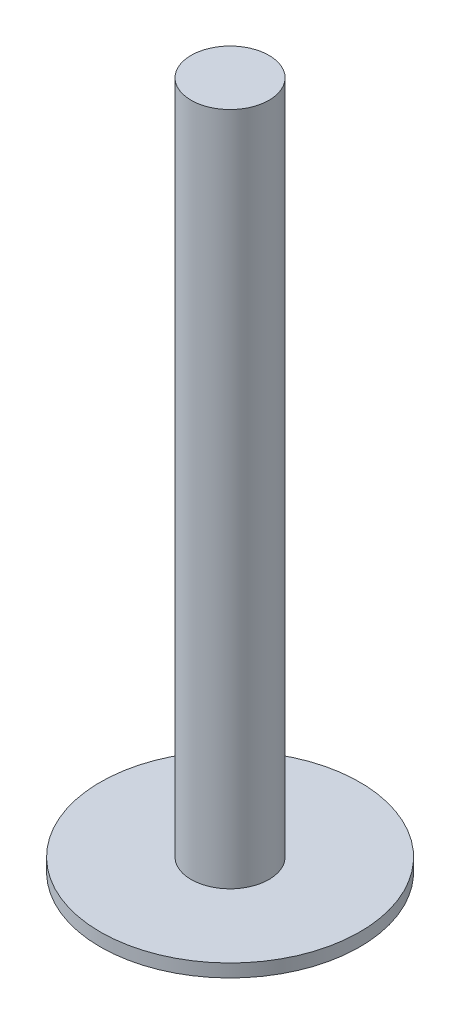
ISO-10303-21;
HEADER;
FILE_DESCRIPTION(('STEP AP214'),'2;1');
FILE_NAME('part.step','',(''),(''),'','','');
FILE_SCHEMA(('AUTOMOTIVE_DESIGN { 1 0 10303 214 1 1 1 1 }'));
ENDSEC;
DATA;
#1=APPLICATION_CONTEXT('core data for automotive mechanical design processes');
#2=APPLICATION_PROTOCOL_DEFINITION('international standard','automotive_design',2000,#1);
#3=PRODUCT_CONTEXT('',#1,'mechanical');
#4=PRODUCT('Part','Part','',(#3));
#5=PRODUCT_RELATED_PRODUCT_CATEGORY('part','',(#4));
#6=PRODUCT_DEFINITION_FORMATION('','',#4);
#7=PRODUCT_DEFINITION_CONTEXT('part definition',#1,'design');
#8=PRODUCT_DEFINITION('design','',#6,#7);
#9=PRODUCT_DEFINITION_SHAPE('','',#8);
#10=(LENGTH_UNIT() NAMED_UNIT(*) SI_UNIT(.MILLI.,.METRE.));
#11=(NAMED_UNIT(*) PLANE_ANGLE_UNIT() SI_UNIT($,.RADIAN.));
#12=(NAMED_UNIT(*) SI_UNIT($,.STERADIAN.) SOLID_ANGLE_UNIT());
#13=UNCERTAINTY_MEASURE_WITH_UNIT(LENGTH_MEASURE(1.E-05),#10,'distance_accuracy_value','');
#14=(GEOMETRIC_REPRESENTATION_CONTEXT(3) GLOBAL_UNCERTAINTY_ASSIGNED_CONTEXT((#13)) GLOBAL_UNIT_ASSIGNED_CONTEXT((#10,
#11,#12)) REPRESENTATION_CONTEXT('',''));
#15=CARTESIAN_POINT('',(0.,0.,0.));
#16=DIRECTION('',(0.,0.,1.));
#17=DIRECTION('',(1.,0.,0.));
#18=AXIS2_PLACEMENT_3D('',#15,#16,#17);
#19=CARTESIAN_POINT('',(0.,0.5,0.));
#20=DIRECTION('',(0.,-1.,0.));
#21=DIRECTION('',(0.,0.,-1.));
#22=AXIS2_PLACEMENT_3D('',#19,#20,#21);
#23=CYLINDRICAL_SURFACE('',#22,5.);
#24=CARTESIAN_POINT('',(0.,0.5,0.));
#25=DIRECTION('',(0.,1.,0.));
#26=DIRECTION('',(0.,0.,1.));
#27=AXIS2_PLACEMENT_3D('',#24,#25,#26);
#28=CIRCLE('',#27,5.);
#29=CARTESIAN_POINT('',(0.,0.5,5.));
#30=VERTEX_POINT('',#29);
#31=EDGE_CURVE('E40',#30,#30,#28,.T.);
#32=ORIENTED_EDGE('',*,*,#31,.F.);
#33=EDGE_LOOP('',(#32));
#34=FACE_BOUND('',#33,.T.);
#35=CARTESIAN_POINT('',(0.,0.,0.));
#36=DIRECTION('',(0.,1.,0.));
#37=DIRECTION('',(0.,0.,1.));
#38=AXIS2_PLACEMENT_3D('',#35,#36,#37);
#39=CIRCLE('',#38,5.);
#40=CARTESIAN_POINT('',(0.,0.,5.));
#41=VERTEX_POINT('',#40);
#42=EDGE_CURVE('E36',#41,#41,#39,.T.);
#43=ORIENTED_EDGE('',*,*,#42,.T.);
#44=EDGE_LOOP('',(#43));
#45=FACE_BOUND('',#44,.T.);
#46=ADVANCED_FACE('F33',(#34,#45),#23,.T.);
#47=CARTESIAN_POINT('',(0.,0.5,0.));
#48=DIRECTION('',(0.,1.,0.));
#49=DIRECTION('',(0.,0.,1.));
#50=AXIS2_PLACEMENT_3D('',#47,#48,#49);
#51=PLANE('',#50);
#52=CARTESIAN_POINT('',(0.,0.5,0.));
#53=DIRECTION('',(0.,1.,0.));
#54=DIRECTION('',(0.,0.,1.));
#55=AXIS2_PLACEMENT_3D('',#52,#53,#54);
#56=CIRCLE('',#55,1.5);
#57=CARTESIAN_POINT('',(0.,0.5,1.5));
#58=VERTEX_POINT('',#57);
#59=EDGE_CURVE('E10',#58,#58,#56,.T.);
#60=ORIENTED_EDGE('',*,*,#59,.F.);
#61=EDGE_LOOP('',(#60));
#62=FACE_BOUND('',#61,.T.);
#63=ORIENTED_EDGE('',*,*,#31,.T.);
#64=EDGE_LOOP('',(#63));
#65=FACE_BOUND('',#64,.T.);
#66=ADVANCED_FACE('F57',(#62,#65),#51,.T.);
#67=CARTESIAN_POINT('',(0.,0.,0.));
#68=DIRECTION('',(0.,1.,0.));
#69=DIRECTION('',(0.,0.,1.));
#70=AXIS2_PLACEMENT_3D('',#67,#68,#69);
#71=PLANE('',#70);
#72=ORIENTED_EDGE('',*,*,#42,.F.);
#73=EDGE_LOOP('',(#72));
#74=FACE_BOUND('',#73,.T.);
#75=ADVANCED_FACE('F54',(#74),#71,.F.);
#76=CARTESIAN_POINT('',(0.,26.5,0.));
#77=DIRECTION('',(0.,-1.,0.));
#78=DIRECTION('',(0.,0.,-1.));
#79=AXIS2_PLACEMENT_3D('',#76,#77,#78);
#80=CYLINDRICAL_SURFACE('',#79,1.5);
#81=CARTESIAN_POINT('',(0.,26.5,0.));
#82=DIRECTION('',(0.,1.,0.));
#83=DIRECTION('',(0.,0.,1.));
#84=AXIS2_PLACEMENT_3D('',#81,#82,#83);
#85=CIRCLE('',#84,1.5);
#86=CARTESIAN_POINT('',(0.,26.5,1.5));
#87=VERTEX_POINT('',#86);
#88=EDGE_CURVE('E46',#87,#87,#85,.T.);
#89=ORIENTED_EDGE('',*,*,#88,.F.);
#90=EDGE_LOOP('',(#89));
#91=FACE_BOUND('',#90,.T.);
#92=ORIENTED_EDGE('',*,*,#59,.T.);
#93=EDGE_LOOP('',(#92));
#94=FACE_BOUND('',#93,.T.);
#95=ADVANCED_FACE('F56',(#91,#94),#80,.T.);
#96=CARTESIAN_POINT('',(0.,26.5,0.));
#97=DIRECTION('',(0.,1.,0.));
#98=DIRECTION('',(0.,0.,1.));
#99=AXIS2_PLACEMENT_3D('',#96,#97,#98);
#100=PLANE('',#99);
#101=ORIENTED_EDGE('',*,*,#88,.T.);
#102=EDGE_LOOP('',(#101));
#103=FACE_BOUND('',#102,.T.);
#104=ADVANCED_FACE('F62',(#103),#100,.T.);
#105=CLOSED_SHELL('',(#46,#66,#75,#95,#104));
#106=MANIFOLD_SOLID_BREP('B2',#105);
#107=ADVANCED_BREP_SHAPE_REPRESENTATION('',(#18,#106),#14);
#108=SHAPE_DEFINITION_REPRESENTATION(#9,#107);
ENDSEC;
END-ISO-10303-21;
